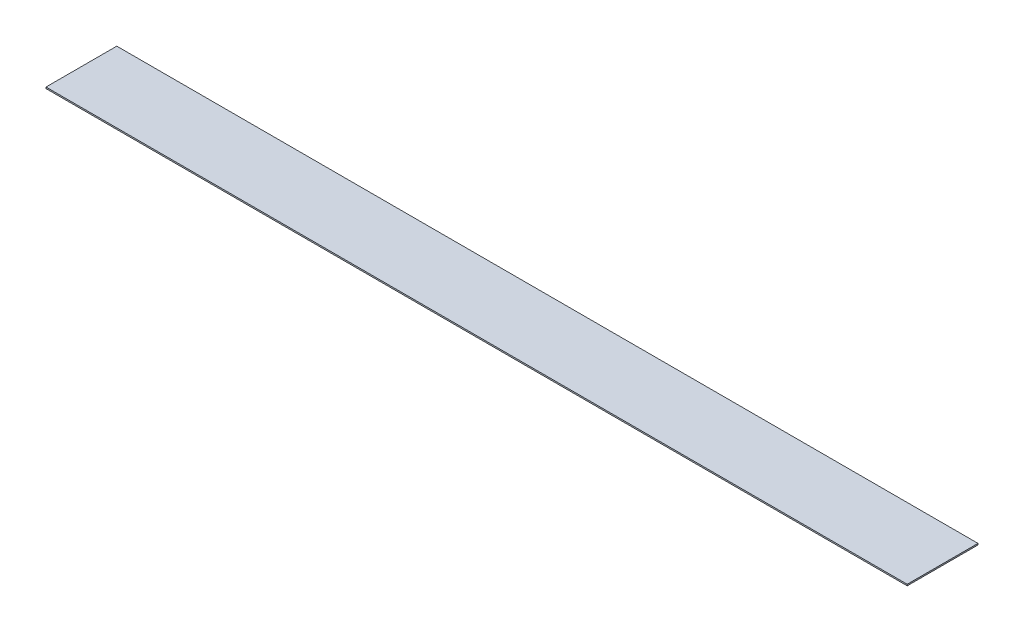
ISO-10303-21;
HEADER;
FILE_DESCRIPTION(('STEP AP214'),'2;1');
FILE_NAME('part.step','',(''),(''),'','','');
FILE_SCHEMA(('AUTOMOTIVE_DESIGN { 1 0 10303 214 1 1 1 1 }'));
ENDSEC;
DATA;
#1=APPLICATION_CONTEXT('core data for automotive mechanical design processes');
#2=APPLICATION_PROTOCOL_DEFINITION('international standard','automotive_design',2000,#1);
#3=PRODUCT_CONTEXT('',#1,'mechanical');
#4=PRODUCT('Part','Part','',(#3));
#5=PRODUCT_RELATED_PRODUCT_CATEGORY('part','',(#4));
#6=PRODUCT_DEFINITION_FORMATION('','',#4);
#7=PRODUCT_DEFINITION_CONTEXT('part definition',#1,'design');
#8=PRODUCT_DEFINITION('design','',#6,#7);
#9=PRODUCT_DEFINITION_SHAPE('','',#8);
#10=(LENGTH_UNIT() NAMED_UNIT(*) SI_UNIT(.MILLI.,.METRE.));
#11=(NAMED_UNIT(*) PLANE_ANGLE_UNIT() SI_UNIT($,.RADIAN.));
#12=(NAMED_UNIT(*) SI_UNIT($,.STERADIAN.) SOLID_ANGLE_UNIT());
#13=UNCERTAINTY_MEASURE_WITH_UNIT(LENGTH_MEASURE(1.E-05),#10,'distance_accuracy_value','');
#14=(GEOMETRIC_REPRESENTATION_CONTEXT(3) GLOBAL_UNCERTAINTY_ASSIGNED_CONTEXT((#13)) GLOBAL_UNIT_ASSIGNED_CONTEXT((#10,
#11,#12)) REPRESENTATION_CONTEXT('',''));
#15=CARTESIAN_POINT('',(0.,0.,0.));
#16=DIRECTION('',(0.,0.,1.));
#17=DIRECTION('',(1.,0.,0.));
#18=AXIS2_PLACEMENT_3D('',#15,#16,#17);
#19=CARTESIAN_POINT('',(0.,3.,0.));
#20=DIRECTION('',(1.,0.,0.));
#21=DIRECTION('',(0.,0.,-1.));
#22=AXIS2_PLACEMENT_3D('',#19,#20,#21);
#23=PLANE('',#22);
#24=DIRECTION('',(0.,0.,1.));
#25=VECTOR('',#24,1.);
#26=CARTESIAN_POINT('',(0.,0.,0.));
#27=LINE('',#26,#25);
#28=CARTESIAN_POINT('',(0.,0.,-150.));
#29=VERTEX_POINT('',#28);
#30=CARTESIAN_POINT('',(0.,0.,0.));
#31=VERTEX_POINT('',#30);
#32=EDGE_CURVE('E96',#29,#31,#27,.T.);
#33=ORIENTED_EDGE('',*,*,#32,.T.);
#34=DIRECTION('',(0.,-1.,0.));
#35=VECTOR('',#34,1.);
#36=CARTESIAN_POINT('',(0.,3.,0.));
#37=LINE('',#36,#35);
#38=CARTESIAN_POINT('',(0.,3.,0.));
#39=VERTEX_POINT('',#38);
#40=EDGE_CURVE('E11',#39,#31,#37,.T.);
#41=ORIENTED_EDGE('',*,*,#40,.F.);
#42=DIRECTION('',(0.,0.,1.));
#43=VECTOR('',#42,1.);
#44=CARTESIAN_POINT('',(0.,3.,0.));
#45=LINE('',#44,#43);
#46=CARTESIAN_POINT('',(0.,3.,-150.));
#47=VERTEX_POINT('',#46);
#48=EDGE_CURVE('E84',#47,#39,#45,.T.);
#49=ORIENTED_EDGE('',*,*,#48,.F.);
#50=DIRECTION('',(0.,-1.,0.));
#51=VECTOR('',#50,1.);
#52=CARTESIAN_POINT('',(0.,3.,-150.));
#53=LINE('',#52,#51);
#54=EDGE_CURVE('E92',#47,#29,#53,.T.);
#55=ORIENTED_EDGE('',*,*,#54,.T.);
#56=EDGE_LOOP('',(#33,#41,#49,#55));
#57=FACE_BOUND('',#56,.T.);
#58=ADVANCED_FACE('F33',(#57),#23,.F.);
#59=CARTESIAN_POINT('',(0.,3.,0.));
#60=DIRECTION('',(0.,0.,-1.));
#61=DIRECTION('',(-1.,0.,0.));
#62=AXIS2_PLACEMENT_3D('',#59,#60,#61);
#63=PLANE('',#62);
#64=DIRECTION('',(1.,0.,0.));
#65=VECTOR('',#64,1.);
#66=CARTESIAN_POINT('',(0.,0.,0.));
#67=LINE('',#66,#65);
#68=CARTESIAN_POINT('',(1825.,0.,0.));
#69=VERTEX_POINT('',#68);
#70=EDGE_CURVE('E88',#31,#69,#67,.T.);
#71=ORIENTED_EDGE('',*,*,#70,.T.);
#72=DIRECTION('',(0.,-1.,0.));
#73=VECTOR('',#72,1.);
#74=CARTESIAN_POINT('',(1825.,3.,0.));
#75=LINE('',#74,#73);
#76=CARTESIAN_POINT('',(1825.,3.,0.));
#77=VERTEX_POINT('',#76);
#78=EDGE_CURVE('E41',#77,#69,#75,.T.);
#79=ORIENTED_EDGE('',*,*,#78,.F.);
#80=DIRECTION('',(1.,0.,0.));
#81=VECTOR('',#80,1.);
#82=CARTESIAN_POINT('',(0.,3.,0.));
#83=LINE('',#82,#81);
#84=EDGE_CURVE('E79',#39,#77,#83,.T.);
#85=ORIENTED_EDGE('',*,*,#84,.F.);
#86=ORIENTED_EDGE('',*,*,#40,.T.);
#87=EDGE_LOOP('',(#71,#79,#85,#86));
#88=FACE_BOUND('',#87,.T.);
#89=ADVANCED_FACE('F87',(#88),#63,.F.);
#90=CARTESIAN_POINT('',(1825.,3.,0.));
#91=DIRECTION('',(-1.,0.,0.));
#92=DIRECTION('',(0.,0.,1.));
#93=AXIS2_PLACEMENT_3D('',#90,#91,#92);
#94=PLANE('',#93);
#95=DIRECTION('',(0.,0.,-1.));
#96=VECTOR('',#95,1.);
#97=CARTESIAN_POINT('',(1825.,0.,0.));
#98=LINE('',#97,#96);
#99=CARTESIAN_POINT('',(1825.,0.,-150.));
#100=VERTEX_POINT('',#99);
#101=EDGE_CURVE('E66',#69,#100,#98,.T.);
#102=ORIENTED_EDGE('',*,*,#101,.T.);
#103=DIRECTION('',(0.,-1.,0.));
#104=VECTOR('',#103,1.);
#105=CARTESIAN_POINT('',(1825.,3.,-150.));
#106=LINE('',#105,#104);
#107=CARTESIAN_POINT('',(1825.,3.,-150.));
#108=VERTEX_POINT('',#107);
#109=EDGE_CURVE('E89',#108,#100,#106,.T.);
#110=ORIENTED_EDGE('',*,*,#109,.F.);
#111=DIRECTION('',(0.,0.,-1.));
#112=VECTOR('',#111,1.);
#113=CARTESIAN_POINT('',(1825.,3.,0.));
#114=LINE('',#113,#112);
#115=EDGE_CURVE('E82',#77,#108,#114,.T.);
#116=ORIENTED_EDGE('',*,*,#115,.F.);
#117=ORIENTED_EDGE('',*,*,#78,.T.);
#118=EDGE_LOOP('',(#102,#110,#116,#117));
#119=FACE_BOUND('',#118,.T.);
#120=ADVANCED_FACE('F90',(#119),#94,.F.);
#121=CARTESIAN_POINT('',(0.,3.,-150.));
#122=DIRECTION('',(0.,0.,1.));
#123=DIRECTION('',(1.,0.,0.));
#124=AXIS2_PLACEMENT_3D('',#121,#122,#123);
#125=PLANE('',#124);
#126=DIRECTION('',(-1.,0.,0.));
#127=VECTOR('',#126,1.);
#128=CARTESIAN_POINT('',(0.,0.,-150.));
#129=LINE('',#128,#127);
#130=EDGE_CURVE('E72',#100,#29,#129,.T.);
#131=ORIENTED_EDGE('',*,*,#130,.T.);
#132=ORIENTED_EDGE('',*,*,#54,.F.);
#133=DIRECTION('',(-1.,0.,0.));
#134=VECTOR('',#133,1.);
#135=CARTESIAN_POINT('',(0.,3.,-150.));
#136=LINE('',#135,#134);
#137=EDGE_CURVE('E49',#108,#47,#136,.T.);
#138=ORIENTED_EDGE('',*,*,#137,.F.);
#139=ORIENTED_EDGE('',*,*,#109,.T.);
#140=EDGE_LOOP('',(#131,#132,#138,#139));
#141=FACE_BOUND('',#140,.T.);
#142=ADVANCED_FACE('F103',(#141),#125,.F.);
#143=CARTESIAN_POINT('',(0.,3.,0.));
#144=DIRECTION('',(0.,-1.,0.));
#145=DIRECTION('',(0.,0.,-1.));
#146=AXIS2_PLACEMENT_3D('',#143,#144,#145);
#147=PLANE('',#146);
#148=ORIENTED_EDGE('',*,*,#48,.T.);
#149=ORIENTED_EDGE('',*,*,#84,.T.);
#150=ORIENTED_EDGE('',*,*,#115,.T.);
#151=ORIENTED_EDGE('',*,*,#137,.T.);
#152=EDGE_LOOP('',(#148,#149,#150,#151));
#153=FACE_BOUND('',#152,.T.);
#154=ADVANCED_FACE('F80',(#153),#147,.F.);
#155=CARTESIAN_POINT('',(0.,0.,0.));
#156=DIRECTION('',(0.,-1.,0.));
#157=DIRECTION('',(0.,0.,-1.));
#158=AXIS2_PLACEMENT_3D('',#155,#156,#157);
#159=PLANE('',#158);
#160=ORIENTED_EDGE('',*,*,#32,.F.);
#161=ORIENTED_EDGE('',*,*,#130,.F.);
#162=ORIENTED_EDGE('',*,*,#101,.F.);
#163=ORIENTED_EDGE('',*,*,#70,.F.);
#164=EDGE_LOOP('',(#160,#161,#162,#163));
#165=FACE_BOUND('',#164,.T.);
#166=ADVANCED_FACE('F106',(#165),#159,.T.);
#167=CLOSED_SHELL('',(#58,#89,#120,#142,#154,#166));
#168=MANIFOLD_SOLID_BREP('B2',#167);
#169=ADVANCED_BREP_SHAPE_REPRESENTATION('',(#18,#168),#14);
#170=SHAPE_DEFINITION_REPRESENTATION(#9,#169);
ENDSEC;
END-ISO-10303-21;
